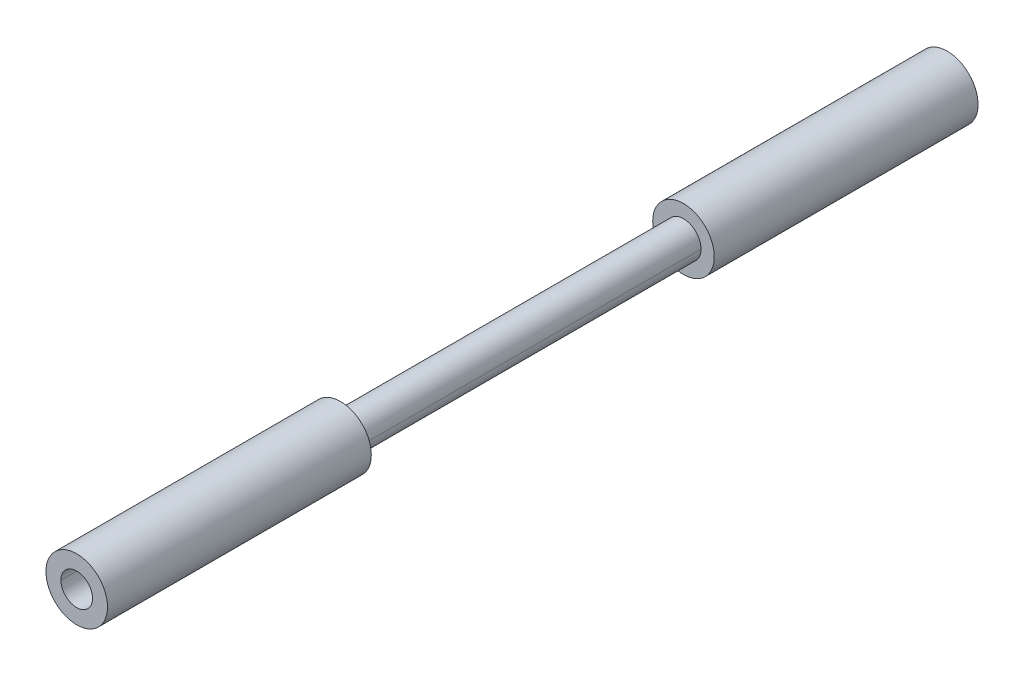
ISO-10303-21;
HEADER;
FILE_DESCRIPTION(('STEP AP214'),'2;1');
FILE_NAME('part.step','',(''),(''),'','','');
FILE_SCHEMA(('AUTOMOTIVE_DESIGN { 1 0 10303 214 1 1 1 1 }'));
ENDSEC;
DATA;
#1=APPLICATION_CONTEXT('core data for automotive mechanical design processes');
#2=APPLICATION_PROTOCOL_DEFINITION('international standard','automotive_design',2000,#1);
#3=PRODUCT_CONTEXT('',#1,'mechanical');
#4=PRODUCT('Part','Part','',(#3));
#5=PRODUCT_RELATED_PRODUCT_CATEGORY('part','',(#4));
#6=PRODUCT_DEFINITION_FORMATION('','',#4);
#7=PRODUCT_DEFINITION_CONTEXT('part definition',#1,'design');
#8=PRODUCT_DEFINITION('design','',#6,#7);
#9=PRODUCT_DEFINITION_SHAPE('','',#8);
#10=(LENGTH_UNIT() NAMED_UNIT(*) SI_UNIT(.MILLI.,.METRE.));
#11=(NAMED_UNIT(*) PLANE_ANGLE_UNIT() SI_UNIT($,.RADIAN.));
#12=(NAMED_UNIT(*) SI_UNIT($,.STERADIAN.) SOLID_ANGLE_UNIT());
#13=UNCERTAINTY_MEASURE_WITH_UNIT(LENGTH_MEASURE(1.E-05),#10,'distance_accuracy_value','');
#14=(GEOMETRIC_REPRESENTATION_CONTEXT(3) GLOBAL_UNCERTAINTY_ASSIGNED_CONTEXT((#13)) GLOBAL_UNIT_ASSIGNED_CONTEXT((#10,
#11,#12)) REPRESENTATION_CONTEXT('',''));
#15=CARTESIAN_POINT('',(0.,0.,0.));
#16=DIRECTION('',(0.,0.,1.));
#17=DIRECTION('',(1.,0.,0.));
#18=AXIS2_PLACEMENT_3D('',#15,#16,#17);
#19=CARTESIAN_POINT('',(0.,0.,495.));
#20=DIRECTION('',(0.,0.,-1.));
#21=DIRECTION('',(-1.,0.,0.));
#22=AXIS2_PLACEMENT_3D('',#19,#20,#21);
#23=CYLINDRICAL_SURFACE('',#22,10.);
#24=DIRECTION('',(0.,0.,-1.));
#25=VECTOR('',#24,1.);
#26=CARTESIAN_POINT('',(-10.,0.,495.));
#27=LINE('',#26,#25);
#28=CARTESIAN_POINT('',(-10.,0.,345.));
#29=VERTEX_POINT('',#28);
#30=CARTESIAN_POINT('',(-10.,0.,150.));
#31=VERTEX_POINT('',#30);
#32=EDGE_CURVE('E95',#29,#31,#27,.T.);
#33=ORIENTED_EDGE('',*,*,#32,.T.);
#34=CARTESIAN_POINT('',(0.,0.,150.));
#35=DIRECTION('',(0.,0.,-1.));
#36=DIRECTION('',(-1.,0.,0.));
#37=AXIS2_PLACEMENT_3D('',#34,#35,#36);
#38=CIRCLE('',#37,10.);
#39=CARTESIAN_POINT('',(10.,0.,150.));
#40=VERTEX_POINT('',#39);
#41=EDGE_CURVE('E56',#40,#31,#38,.T.);
#42=ORIENTED_EDGE('',*,*,#41,.F.);
#43=DIRECTION('',(0.,0.,-1.));
#44=VECTOR('',#43,1.);
#45=CARTESIAN_POINT('',(10.,0.,495.));
#46=LINE('',#45,#44);
#47=CARTESIAN_POINT('',(10.,0.,345.));
#48=VERTEX_POINT('',#47);
#49=EDGE_CURVE('E94',#48,#40,#46,.T.);
#50=ORIENTED_EDGE('',*,*,#49,.F.);
#51=CARTESIAN_POINT('',(0.,0.,345.));
#52=DIRECTION('',(0.,0.,1.));
#53=DIRECTION('',(1.,0.,0.));
#54=AXIS2_PLACEMENT_3D('',#51,#52,#53);
#55=CIRCLE('',#54,10.);
#56=EDGE_CURVE('E63',#29,#48,#55,.T.);
#57=ORIENTED_EDGE('',*,*,#56,.F.);
#58=EDGE_LOOP('',(#33,#42,#50,#57));
#59=FACE_BOUND('',#58,.T.);
#60=ADVANCED_FACE('F39',(#59),#23,.T.);
#61=CARTESIAN_POINT('',(0.,0.,495.));
#62=DIRECTION('',(0.,0.,-1.));
#63=DIRECTION('',(-1.,0.,0.));
#64=AXIS2_PLACEMENT_3D('',#61,#62,#63);
#65=CYLINDRICAL_SURFACE('',#64,10.);
#66=ORIENTED_EDGE('',*,*,#49,.T.);
#67=EDGE_CURVE('E83',#31,#40,#38,.T.);
#68=ORIENTED_EDGE('',*,*,#67,.F.);
#69=ORIENTED_EDGE('',*,*,#32,.F.);
#70=EDGE_CURVE('E97',#48,#29,#55,.T.);
#71=ORIENTED_EDGE('',*,*,#70,.F.);
#72=EDGE_LOOP('',(#66,#68,#69,#71));
#73=FACE_BOUND('',#72,.T.);
#74=ADVANCED_FACE('F96',(#73),#65,.T.);
#75=CARTESIAN_POINT('',(0.,0.,495.));
#76=DIRECTION('',(0.,0.,-1.));
#77=DIRECTION('',(-1.,0.,0.));
#78=AXIS2_PLACEMENT_3D('',#75,#76,#77);
#79=CYLINDRICAL_SURFACE('',#78,9.);
#80=DIRECTION('',(0.,0.,-1.));
#81=VECTOR('',#80,1.);
#82=CARTESIAN_POINT('',(9.,0.,495.));
#83=LINE('',#82,#81);
#84=CARTESIAN_POINT('',(9.,0.,495.));
#85=VERTEX_POINT('',#84);
#86=CARTESIAN_POINT('',(9.,0.,0.));
#87=VERTEX_POINT('',#86);
#88=EDGE_CURVE('E107',#85,#87,#83,.T.);
#89=ORIENTED_EDGE('',*,*,#88,.F.);
#90=CARTESIAN_POINT('',(0.,0.,495.));
#91=DIRECTION('',(0.,0.,1.));
#92=DIRECTION('',(1.,0.,0.));
#93=AXIS2_PLACEMENT_3D('',#90,#91,#92);
#94=CIRCLE('',#93,9.);
#95=CARTESIAN_POINT('',(-9.,0.,495.));
#96=VERTEX_POINT('',#95);
#97=EDGE_CURVE('E49',#85,#96,#94,.T.);
#98=ORIENTED_EDGE('',*,*,#97,.T.);
#99=DIRECTION('',(0.,0.,-1.));
#100=VECTOR('',#99,1.);
#101=CARTESIAN_POINT('',(-9.,0.,495.));
#102=LINE('',#101,#100);
#103=CARTESIAN_POINT('',(-9.,0.,0.));
#104=VERTEX_POINT('',#103);
#105=EDGE_CURVE('E98',#96,#104,#102,.T.);
#106=ORIENTED_EDGE('',*,*,#105,.T.);
#107=CARTESIAN_POINT('',(0.,0.,0.));
#108=DIRECTION('',(0.,0.,1.));
#109=DIRECTION('',(1.,0.,0.));
#110=AXIS2_PLACEMENT_3D('',#107,#108,#109);
#111=CIRCLE('',#110,9.);
#112=EDGE_CURVE('E11',#87,#104,#111,.T.);
#113=ORIENTED_EDGE('',*,*,#112,.F.);
#114=EDGE_LOOP('',(#89,#98,#106,#113));
#115=FACE_BOUND('',#114,.T.);
#116=ADVANCED_FACE('F121',(#115),#79,.F.);
#117=CARTESIAN_POINT('',(0.,0.,0.));
#118=DIRECTION('',(0.,0.,1.));
#119=DIRECTION('',(1.,0.,0.));
#120=AXIS2_PLACEMENT_3D('',#117,#118,#119);
#121=PLANE('',#120);
#122=CARTESIAN_POINT('',(0.,0.,0.));
#123=DIRECTION('',(0.,0.,1.));
#124=DIRECTION('',(1.,0.,0.));
#125=AXIS2_PLACEMENT_3D('',#122,#123,#124);
#126=CIRCLE('',#125,9.);
#127=EDGE_CURVE('E43',#104,#87,#126,.T.);
#128=ORIENTED_EDGE('',*,*,#127,.T.);
#129=ORIENTED_EDGE('',*,*,#112,.T.);
#130=EDGE_LOOP('',(#128,#129));
#131=FACE_BOUND('',#130,.T.);
#132=CARTESIAN_POINT('',(0.,0.,0.));
#133=DIRECTION('',(0.,0.,-1.));
#134=DIRECTION('',(-1.,0.,0.));
#135=AXIS2_PLACEMENT_3D('',#132,#133,#134);
#136=CIRCLE('',#135,17.5);
#137=CARTESIAN_POINT('',(-17.5,0.,0.));
#138=VERTEX_POINT('',#137);
#139=EDGE_CURVE('E90',#138,#138,#136,.T.);
#140=ORIENTED_EDGE('',*,*,#139,.T.);
#141=EDGE_LOOP('',(#140));
#142=FACE_BOUND('',#141,.T.);
#143=ADVANCED_FACE('F130',(#131,#142),#121,.F.);
#144=CARTESIAN_POINT('',(0.,0.,495.));
#145=DIRECTION('',(0.,0.,1.));
#146=DIRECTION('',(1.,0.,0.));
#147=AXIS2_PLACEMENT_3D('',#144,#145,#146);
#148=PLANE('',#147);
#149=CARTESIAN_POINT('',(0.,0.,495.));
#150=DIRECTION('',(0.,0.,1.));
#151=DIRECTION('',(1.,0.,0.));
#152=AXIS2_PLACEMENT_3D('',#149,#150,#151);
#153=CIRCLE('',#152,9.);
#154=EDGE_CURVE('E110',#96,#85,#153,.T.);
#155=ORIENTED_EDGE('',*,*,#154,.F.);
#156=ORIENTED_EDGE('',*,*,#97,.F.);
#157=EDGE_LOOP('',(#155,#156));
#158=FACE_BOUND('',#157,.T.);
#159=CARTESIAN_POINT('',(0.,0.,495.));
#160=DIRECTION('',(0.,0.,1.));
#161=DIRECTION('',(1.,0.,0.));
#162=AXIS2_PLACEMENT_3D('',#159,#160,#161);
#163=CIRCLE('',#162,17.5);
#164=CARTESIAN_POINT('',(17.5,0.,495.));
#165=VERTEX_POINT('',#164);
#166=EDGE_CURVE('E105',#165,#165,#163,.T.);
#167=ORIENTED_EDGE('',*,*,#166,.T.);
#168=EDGE_LOOP('',(#167));
#169=FACE_BOUND('',#168,.T.);
#170=ADVANCED_FACE('F127',(#158,#169),#148,.T.);
#171=CARTESIAN_POINT('',(0.,0.,495.));
#172=DIRECTION('',(0.,0.,-1.));
#173=DIRECTION('',(-1.,0.,0.));
#174=AXIS2_PLACEMENT_3D('',#171,#172,#173);
#175=CYLINDRICAL_SURFACE('',#174,9.);
#176=ORIENTED_EDGE('',*,*,#154,.T.);
#177=ORIENTED_EDGE('',*,*,#88,.T.);
#178=ORIENTED_EDGE('',*,*,#127,.F.);
#179=ORIENTED_EDGE('',*,*,#105,.F.);
#180=EDGE_LOOP('',(#176,#177,#178,#179));
#181=FACE_BOUND('',#180,.T.);
#182=ADVANCED_FACE('F41',(#181),#175,.F.);
#183=CARTESIAN_POINT('',(0.,0.,345.));
#184=DIRECTION('',(0.,0.,1.));
#185=DIRECTION('',(1.,0.,0.));
#186=AXIS2_PLACEMENT_3D('',#183,#184,#185);
#187=CYLINDRICAL_SURFACE('',#186,17.5);
#188=CARTESIAN_POINT('',(0.,0.,345.));
#189=DIRECTION('',(0.,0.,1.));
#190=DIRECTION('',(1.,0.,0.));
#191=AXIS2_PLACEMENT_3D('',#188,#189,#190);
#192=CIRCLE('',#191,17.5);
#193=CARTESIAN_POINT('',(17.5,0.,345.));
#194=VERTEX_POINT('',#193);
#195=EDGE_CURVE('E115',#194,#194,#192,.T.);
#196=ORIENTED_EDGE('',*,*,#195,.T.);
#197=EDGE_LOOP('',(#196));
#198=FACE_BOUND('',#197,.T.);
#199=ORIENTED_EDGE('',*,*,#166,.F.);
#200=EDGE_LOOP('',(#199));
#201=FACE_BOUND('',#200,.T.);
#202=ADVANCED_FACE('F191',(#198,#201),#187,.T.);
#203=CARTESIAN_POINT('',(0.,0.,345.));
#204=DIRECTION('',(0.,0.,1.));
#205=DIRECTION('',(1.,0.,0.));
#206=AXIS2_PLACEMENT_3D('',#203,#204,#205);
#207=PLANE('',#206);
#208=ORIENTED_EDGE('',*,*,#70,.T.);
#209=ORIENTED_EDGE('',*,*,#56,.T.);
#210=EDGE_LOOP('',(#208,#209));
#211=FACE_BOUND('',#210,.T.);
#212=ORIENTED_EDGE('',*,*,#195,.F.);
#213=EDGE_LOOP('',(#212));
#214=FACE_BOUND('',#213,.T.);
#215=ADVANCED_FACE('F151',(#211,#214),#207,.F.);
#216=CARTESIAN_POINT('',(0.,0.,150.));
#217=DIRECTION('',(0.,0.,-1.));
#218=DIRECTION('',(-1.,0.,0.));
#219=AXIS2_PLACEMENT_3D('',#216,#217,#218);
#220=CYLINDRICAL_SURFACE('',#219,17.5);
#221=CARTESIAN_POINT('',(0.,0.,150.));
#222=DIRECTION('',(0.,0.,-1.));
#223=DIRECTION('',(-1.,0.,0.));
#224=AXIS2_PLACEMENT_3D('',#221,#222,#223);
#225=CIRCLE('',#224,17.5);
#226=CARTESIAN_POINT('',(-17.5,0.,150.));
#227=VERTEX_POINT('',#226);
#228=EDGE_CURVE('E137',#227,#227,#225,.T.);
#229=ORIENTED_EDGE('',*,*,#228,.T.);
#230=EDGE_LOOP('',(#229));
#231=FACE_BOUND('',#230,.T.);
#232=ORIENTED_EDGE('',*,*,#139,.F.);
#233=EDGE_LOOP('',(#232));
#234=FACE_BOUND('',#233,.T.);
#235=ADVANCED_FACE('F144',(#231,#234),#220,.T.);
#236=CARTESIAN_POINT('',(0.,0.,150.));
#237=DIRECTION('',(0.,0.,-1.));
#238=DIRECTION('',(-1.,0.,0.));
#239=AXIS2_PLACEMENT_3D('',#236,#237,#238);
#240=PLANE('',#239);
#241=ORIENTED_EDGE('',*,*,#67,.T.);
#242=ORIENTED_EDGE('',*,*,#41,.T.);
#243=EDGE_LOOP('',(#241,#242));
#244=FACE_BOUND('',#243,.T.);
#245=ORIENTED_EDGE('',*,*,#228,.F.);
#246=EDGE_LOOP('',(#245));
#247=FACE_BOUND('',#246,.T.);
#248=ADVANCED_FACE('F84',(#244,#247),#240,.F.);
#249=CLOSED_SHELL('',(#60,#74,#116,#143,#170,#182,#202,#215,#235,#248));
#250=MANIFOLD_SOLID_BREP('B2',#249);
#251=ADVANCED_BREP_SHAPE_REPRESENTATION('',(#18,#250),#14);
#252=SHAPE_DEFINITION_REPRESENTATION(#9,#251);
ENDSEC;
END-ISO-10303-21;
